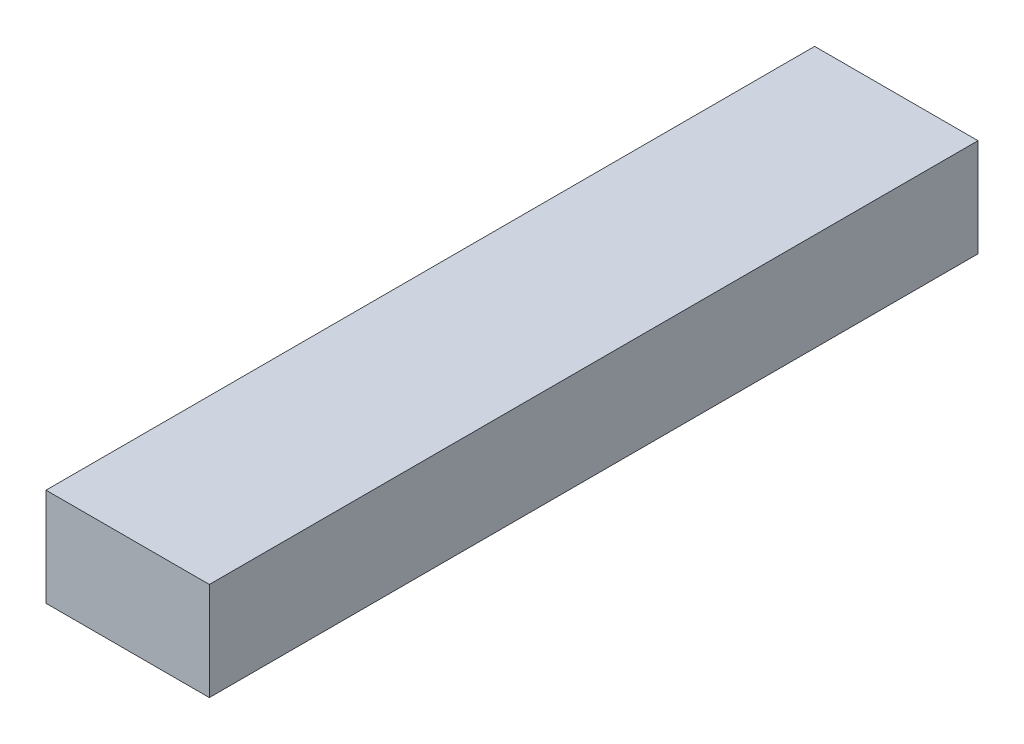
ISO-10303-21;
HEADER;
FILE_DESCRIPTION(('STEP AP214'),'2;1');
FILE_NAME('part.step','',(''),(''),'','','');
FILE_SCHEMA(('AUTOMOTIVE_DESIGN { 1 0 10303 214 1 1 1 1 }'));
ENDSEC;
DATA;
#1=APPLICATION_CONTEXT('core data for automotive mechanical design processes');
#2=APPLICATION_PROTOCOL_DEFINITION('international standard','automotive_design',2000,#1);
#3=PRODUCT_CONTEXT('',#1,'mechanical');
#4=PRODUCT('Part','Part','',(#3));
#5=PRODUCT_RELATED_PRODUCT_CATEGORY('part','',(#4));
#6=PRODUCT_DEFINITION_FORMATION('','',#4);
#7=PRODUCT_DEFINITION_CONTEXT('part definition',#1,'design');
#8=PRODUCT_DEFINITION('design','',#6,#7);
#9=PRODUCT_DEFINITION_SHAPE('','',#8);
#10=(LENGTH_UNIT() NAMED_UNIT(*) SI_UNIT(.MILLI.,.METRE.));
#11=(NAMED_UNIT(*) PLANE_ANGLE_UNIT() SI_UNIT($,.RADIAN.));
#12=(NAMED_UNIT(*) SI_UNIT($,.STERADIAN.) SOLID_ANGLE_UNIT());
#13=UNCERTAINTY_MEASURE_WITH_UNIT(LENGTH_MEASURE(1.E-05),#10,'distance_accuracy_value','');
#14=(GEOMETRIC_REPRESENTATION_CONTEXT(3) GLOBAL_UNCERTAINTY_ASSIGNED_CONTEXT((#13)) GLOBAL_UNIT_ASSIGNED_CONTEXT((#10,
#11,#12)) REPRESENTATION_CONTEXT('',''));
#15=CARTESIAN_POINT('',(0.,0.,0.));
#16=DIRECTION('',(0.,0.,1.));
#17=DIRECTION('',(1.,0.,0.));
#18=AXIS2_PLACEMENT_3D('',#15,#16,#17);
#19=CARTESIAN_POINT('',(0.,0.,-298.8));
#20=DIRECTION('',(-1.,0.,0.));
#21=DIRECTION('',(0.,0.,1.));
#22=AXIS2_PLACEMENT_3D('',#19,#20,#21);
#23=PLANE('',#22);
#24=DIRECTION('',(0.,-1.,0.));
#25=VECTOR('',#24,1.);
#26=CARTESIAN_POINT('',(0.,0.,0.));
#27=LINE('',#26,#25);
#28=CARTESIAN_POINT('',(0.,38.1,0.));
#29=VERTEX_POINT('',#28);
#30=CARTESIAN_POINT('',(0.,0.,0.));
#31=VERTEX_POINT('',#30);
#32=EDGE_CURVE('E101',#29,#31,#27,.T.);
#33=ORIENTED_EDGE('',*,*,#32,.F.);
#34=DIRECTION('',(0.,0.,1.));
#35=VECTOR('',#34,1.);
#36=CARTESIAN_POINT('',(0.,38.1,-298.8));
#37=LINE('',#36,#35);
#38=CARTESIAN_POINT('',(0.,38.1,-298.8));
#39=VERTEX_POINT('',#38);
#40=EDGE_CURVE('E11',#39,#29,#37,.T.);
#41=ORIENTED_EDGE('',*,*,#40,.F.);
#42=DIRECTION('',(0.,-1.,0.));
#43=VECTOR('',#42,1.);
#44=CARTESIAN_POINT('',(0.,0.,-298.8));
#45=LINE('',#44,#43);
#46=CARTESIAN_POINT('',(0.,0.,-298.8));
#47=VERTEX_POINT('',#46);
#48=EDGE_CURVE('E95',#39,#47,#45,.T.);
#49=ORIENTED_EDGE('',*,*,#48,.T.);
#50=DIRECTION('',(0.,0.,1.));
#51=VECTOR('',#50,1.);
#52=CARTESIAN_POINT('',(0.,0.,-298.8));
#53=LINE('',#52,#51);
#54=EDGE_CURVE('E40',#47,#31,#53,.T.);
#55=ORIENTED_EDGE('',*,*,#54,.T.);
#56=EDGE_LOOP('',(#33,#41,#49,#55));
#57=FACE_BOUND('',#56,.T.);
#58=ADVANCED_FACE('F37',(#57),#23,.T.);
#59=CARTESIAN_POINT('',(0.,38.1,-298.8));
#60=DIRECTION('',(0.,1.,0.));
#61=DIRECTION('',(0.,0.,1.));
#62=AXIS2_PLACEMENT_3D('',#59,#60,#61);
#63=PLANE('',#62);
#64=DIRECTION('',(-1.,0.,0.));
#65=VECTOR('',#64,1.);
#66=CARTESIAN_POINT('',(0.,38.1,0.));
#67=LINE('',#66,#65);
#68=CARTESIAN_POINT('',(63.5,38.1,0.));
#69=VERTEX_POINT('',#68);
#70=EDGE_CURVE('E97',#69,#29,#67,.T.);
#71=ORIENTED_EDGE('',*,*,#70,.F.);
#72=DIRECTION('',(0.,0.,1.));
#73=VECTOR('',#72,1.);
#74=CARTESIAN_POINT('',(63.5,38.1,-298.8));
#75=LINE('',#74,#73);
#76=CARTESIAN_POINT('',(63.5,38.1,-298.8));
#77=VERTEX_POINT('',#76);
#78=EDGE_CURVE('E46',#77,#69,#75,.T.);
#79=ORIENTED_EDGE('',*,*,#78,.F.);
#80=DIRECTION('',(-1.,0.,0.));
#81=VECTOR('',#80,1.);
#82=CARTESIAN_POINT('',(0.,38.1,-298.8));
#83=LINE('',#82,#81);
#84=EDGE_CURVE('E92',#77,#39,#83,.T.);
#85=ORIENTED_EDGE('',*,*,#84,.T.);
#86=ORIENTED_EDGE('',*,*,#40,.T.);
#87=EDGE_LOOP('',(#71,#79,#85,#86));
#88=FACE_BOUND('',#87,.T.);
#89=ADVANCED_FACE('F111',(#88),#63,.T.);
#90=CARTESIAN_POINT('',(63.5,0.,-298.8));
#91=DIRECTION('',(1.,0.,0.));
#92=DIRECTION('',(0.,0.,-1.));
#93=AXIS2_PLACEMENT_3D('',#90,#91,#92);
#94=PLANE('',#93);
#95=DIRECTION('',(0.,1.,0.));
#96=VECTOR('',#95,1.);
#97=CARTESIAN_POINT('',(63.5,0.,0.));
#98=LINE('',#97,#96);
#99=CARTESIAN_POINT('',(63.5,0.,0.));
#100=VERTEX_POINT('',#99);
#101=EDGE_CURVE('E87',#100,#69,#98,.T.);
#102=ORIENTED_EDGE('',*,*,#101,.F.);
#103=DIRECTION('',(0.,0.,1.));
#104=VECTOR('',#103,1.);
#105=CARTESIAN_POINT('',(63.5,0.,-298.8));
#106=LINE('',#105,#104);
#107=CARTESIAN_POINT('',(63.5,0.,-298.8));
#108=VERTEX_POINT('',#107);
#109=EDGE_CURVE('E82',#108,#100,#106,.T.);
#110=ORIENTED_EDGE('',*,*,#109,.F.);
#111=DIRECTION('',(0.,1.,0.));
#112=VECTOR('',#111,1.);
#113=CARTESIAN_POINT('',(63.5,0.,-298.8));
#114=LINE('',#113,#112);
#115=EDGE_CURVE('E85',#108,#77,#114,.T.);
#116=ORIENTED_EDGE('',*,*,#115,.T.);
#117=ORIENTED_EDGE('',*,*,#78,.T.);
#118=EDGE_LOOP('',(#102,#110,#116,#117));
#119=FACE_BOUND('',#118,.T.);
#120=ADVANCED_FACE('F84',(#119),#94,.T.);
#121=CARTESIAN_POINT('',(0.,0.,-298.8));
#122=DIRECTION('',(0.,-1.,0.));
#123=DIRECTION('',(0.,0.,-1.));
#124=AXIS2_PLACEMENT_3D('',#121,#122,#123);
#125=PLANE('',#124);
#126=DIRECTION('',(1.,0.,0.));
#127=VECTOR('',#126,1.);
#128=CARTESIAN_POINT('',(0.,0.,0.));
#129=LINE('',#128,#127);
#130=EDGE_CURVE('E104',#31,#100,#129,.T.);
#131=ORIENTED_EDGE('',*,*,#130,.F.);
#132=ORIENTED_EDGE('',*,*,#54,.F.);
#133=DIRECTION('',(1.,0.,0.));
#134=VECTOR('',#133,1.);
#135=CARTESIAN_POINT('',(0.,0.,-298.8));
#136=LINE('',#135,#134);
#137=EDGE_CURVE('E91',#47,#108,#136,.T.);
#138=ORIENTED_EDGE('',*,*,#137,.T.);
#139=ORIENTED_EDGE('',*,*,#109,.T.);
#140=EDGE_LOOP('',(#131,#132,#138,#139));
#141=FACE_BOUND('',#140,.T.);
#142=ADVANCED_FACE('F94',(#141),#125,.T.);
#143=CARTESIAN_POINT('',(0.,0.,-298.8));
#144=DIRECTION('',(0.,0.,-1.));
#145=DIRECTION('',(-1.,0.,0.));
#146=AXIS2_PLACEMENT_3D('',#143,#144,#145);
#147=PLANE('',#146);
#148=ORIENTED_EDGE('',*,*,#48,.F.);
#149=ORIENTED_EDGE('',*,*,#84,.F.);
#150=ORIENTED_EDGE('',*,*,#115,.F.);
#151=ORIENTED_EDGE('',*,*,#137,.F.);
#152=EDGE_LOOP('',(#148,#149,#150,#151));
#153=FACE_BOUND('',#152,.T.);
#154=ADVANCED_FACE('F90',(#153),#147,.T.);
#155=CARTESIAN_POINT('',(0.,0.,0.));
#156=DIRECTION('',(0.,0.,-1.));
#157=DIRECTION('',(-1.,0.,0.));
#158=AXIS2_PLACEMENT_3D('',#155,#156,#157);
#159=PLANE('',#158);
#160=ORIENTED_EDGE('',*,*,#32,.T.);
#161=ORIENTED_EDGE('',*,*,#130,.T.);
#162=ORIENTED_EDGE('',*,*,#101,.T.);
#163=ORIENTED_EDGE('',*,*,#70,.T.);
#164=EDGE_LOOP('',(#160,#161,#162,#163));
#165=FACE_BOUND('',#164,.T.);
#166=ADVANCED_FACE('F110',(#165),#159,.F.);
#167=CLOSED_SHELL('',(#58,#89,#120,#142,#154,#166));
#168=MANIFOLD_SOLID_BREP('B2',#167);
#169=ADVANCED_BREP_SHAPE_REPRESENTATION('',(#18,#168),#14);
#170=SHAPE_DEFINITION_REPRESENTATION(#9,#169);
ENDSEC;
END-ISO-10303-21;
